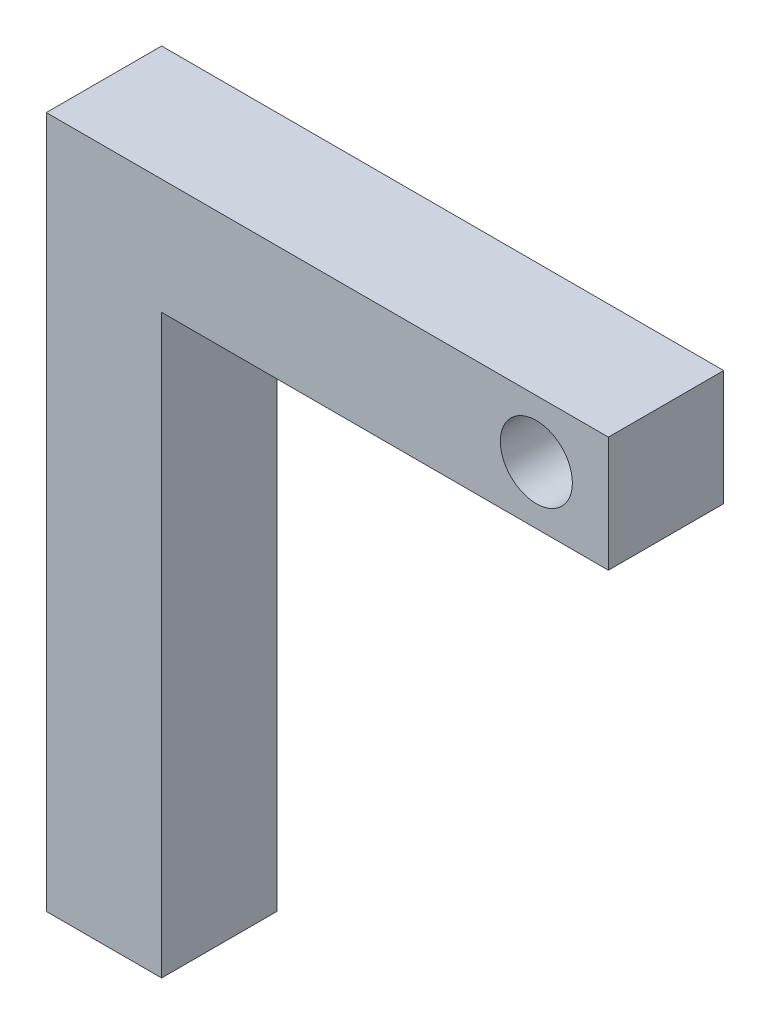
ISO-10303-21;
HEADER;
FILE_DESCRIPTION(('STEP AP214'),'2;1');
FILE_NAME('part.step','',(''),(''),'','','');
FILE_SCHEMA(('AUTOMOTIVE_DESIGN { 1 0 10303 214 1 1 1 1 }'));
ENDSEC;
DATA;
#1=APPLICATION_CONTEXT('core data for automotive mechanical design processes');
#2=APPLICATION_PROTOCOL_DEFINITION('international standard','automotive_design',2000,#1);
#3=PRODUCT_CONTEXT('',#1,'mechanical');
#4=PRODUCT('Part','Part','',(#3));
#5=PRODUCT_RELATED_PRODUCT_CATEGORY('part','',(#4));
#6=PRODUCT_DEFINITION_FORMATION('','',#4);
#7=PRODUCT_DEFINITION_CONTEXT('part definition',#1,'design');
#8=PRODUCT_DEFINITION('design','',#6,#7);
#9=PRODUCT_DEFINITION_SHAPE('','',#8);
#10=(LENGTH_UNIT() NAMED_UNIT(*) SI_UNIT(.MILLI.,.METRE.));
#11=(NAMED_UNIT(*) PLANE_ANGLE_UNIT() SI_UNIT($,.RADIAN.));
#12=(NAMED_UNIT(*) SI_UNIT($,.STERADIAN.) SOLID_ANGLE_UNIT());
#13=UNCERTAINTY_MEASURE_WITH_UNIT(LENGTH_MEASURE(1.E-05),#10,'distance_accuracy_value','');
#14=(GEOMETRIC_REPRESENTATION_CONTEXT(3) GLOBAL_UNCERTAINTY_ASSIGNED_CONTEXT((#13)) GLOBAL_UNIT_ASSIGNED_CONTEXT((#10,
#11,#12)) REPRESENTATION_CONTEXT('',''));
#15=CARTESIAN_POINT('',(0.,0.,0.));
#16=DIRECTION('',(0.,0.,1.));
#17=DIRECTION('',(1.,0.,0.));
#18=AXIS2_PLACEMENT_3D('',#15,#16,#17);
#19=CARTESIAN_POINT('',(80.,0.,80.));
#20=DIRECTION('',(0.,1.,0.));
#21=DIRECTION('',(0.,0.,1.));
#22=AXIS2_PLACEMENT_3D('',#19,#20,#21);
#23=PLANE('',#22);
#24=DIRECTION('',(1.,0.,0.));
#25=VECTOR('',#24,1.);
#26=CARTESIAN_POINT('',(80.,0.,0.));
#27=LINE('',#26,#25);
#28=CARTESIAN_POINT('',(0.,0.,0.));
#29=VERTEX_POINT('',#28);
#30=CARTESIAN_POINT('',(80.,0.,0.));
#31=VERTEX_POINT('',#30);
#32=EDGE_CURVE('E129',#29,#31,#27,.T.);
#33=ORIENTED_EDGE('',*,*,#32,.T.);
#34=DIRECTION('',(0.,0.,-1.));
#35=VECTOR('',#34,1.);
#36=CARTESIAN_POINT('',(80.,0.,80.));
#37=LINE('',#36,#35);
#38=CARTESIAN_POINT('',(80.,0.,80.));
#39=VERTEX_POINT('',#38);
#40=EDGE_CURVE('E11',#39,#31,#37,.T.);
#41=ORIENTED_EDGE('',*,*,#40,.F.);
#42=DIRECTION('',(1.,0.,0.));
#43=VECTOR('',#42,1.);
#44=CARTESIAN_POINT('',(80.,0.,80.));
#45=LINE('',#44,#43);
#46=CARTESIAN_POINT('',(0.,0.,80.));
#47=VERTEX_POINT('',#46);
#48=EDGE_CURVE('E145',#47,#39,#45,.T.);
#49=ORIENTED_EDGE('',*,*,#48,.F.);
#50=DIRECTION('',(0.,0.,-1.));
#51=VECTOR('',#50,1.);
#52=CARTESIAN_POINT('',(0.,0.,80.));
#53=LINE('',#52,#51);
#54=EDGE_CURVE('E125',#47,#29,#53,.T.);
#55=ORIENTED_EDGE('',*,*,#54,.T.);
#56=EDGE_LOOP('',(#33,#41,#49,#55));
#57=FACE_BOUND('',#56,.T.);
#58=ADVANCED_FACE('F39',(#57),#23,.F.);
#59=CARTESIAN_POINT('',(80.,400.000000000005,80.));
#60=DIRECTION('',(-1.,0.,0.));
#61=DIRECTION('',(0.,-1.,0.));
#62=AXIS2_PLACEMENT_3D('',#59,#60,#61);
#63=PLANE('',#62);
#64=DIRECTION('',(0.,1.,0.));
#65=VECTOR('',#64,1.);
#66=CARTESIAN_POINT('',(80.,400.000000000005,0.));
#67=LINE('',#66,#65);
#68=CARTESIAN_POINT('',(80.,400.000000000005,0.));
#69=VERTEX_POINT('',#68);
#70=EDGE_CURVE('E133',#31,#69,#67,.T.);
#71=ORIENTED_EDGE('',*,*,#70,.T.);
#72=DIRECTION('',(0.,0.,-1.));
#73=VECTOR('',#72,1.);
#74=CARTESIAN_POINT('',(80.,400.000000000005,80.));
#75=LINE('',#74,#73);
#76=CARTESIAN_POINT('',(80.,400.000000000005,80.));
#77=VERTEX_POINT('',#76);
#78=EDGE_CURVE('E49',#77,#69,#75,.T.);
#79=ORIENTED_EDGE('',*,*,#78,.F.);
#80=DIRECTION('',(0.,1.,0.));
#81=VECTOR('',#80,1.);
#82=CARTESIAN_POINT('',(80.,400.000000000005,80.));
#83=LINE('',#82,#81);
#84=EDGE_CURVE('E94',#39,#77,#83,.T.);
#85=ORIENTED_EDGE('',*,*,#84,.F.);
#86=ORIENTED_EDGE('',*,*,#40,.T.);
#87=EDGE_LOOP('',(#71,#79,#85,#86));
#88=FACE_BOUND('',#87,.T.);
#89=ADVANCED_FACE('F175',(#88),#63,.F.);
#90=CARTESIAN_POINT('',(390.,400.000000000005,80.));
#91=DIRECTION('',(0.,1.,0.));
#92=DIRECTION('',(0.,0.,1.));
#93=AXIS2_PLACEMENT_3D('',#90,#91,#92);
#94=PLANE('',#93);
#95=DIRECTION('',(1.,0.,0.));
#96=VECTOR('',#95,1.);
#97=CARTESIAN_POINT('',(390.,400.000000000005,0.));
#98=LINE('',#97,#96);
#99=CARTESIAN_POINT('',(390.,400.000000000005,0.));
#100=VERTEX_POINT('',#99);
#101=EDGE_CURVE('E136',#69,#100,#98,.T.);
#102=ORIENTED_EDGE('',*,*,#101,.T.);
#103=DIRECTION('',(0.,0.,-1.));
#104=VECTOR('',#103,1.);
#105=CARTESIAN_POINT('',(390.,400.000000000005,80.));
#106=LINE('',#105,#104);
#107=CARTESIAN_POINT('',(390.,400.000000000005,80.));
#108=VERTEX_POINT('',#107);
#109=EDGE_CURVE('E118',#108,#100,#106,.T.);
#110=ORIENTED_EDGE('',*,*,#109,.F.);
#111=DIRECTION('',(1.,0.,0.));
#112=VECTOR('',#111,1.);
#113=CARTESIAN_POINT('',(390.,400.000000000005,80.));
#114=LINE('',#113,#112);
#115=EDGE_CURVE('E107',#77,#108,#114,.T.);
#116=ORIENTED_EDGE('',*,*,#115,.F.);
#117=ORIENTED_EDGE('',*,*,#78,.T.);
#118=EDGE_LOOP('',(#102,#110,#116,#117));
#119=FACE_BOUND('',#118,.T.);
#120=ADVANCED_FACE('F156',(#119),#94,.F.);
#121=CARTESIAN_POINT('',(390.,480.000000000005,80.));
#122=DIRECTION('',(-1.,0.,0.));
#123=DIRECTION('',(0.,0.,1.));
#124=AXIS2_PLACEMENT_3D('',#121,#122,#123);
#125=PLANE('',#124);
#126=DIRECTION('',(0.,1.,0.));
#127=VECTOR('',#126,1.);
#128=CARTESIAN_POINT('',(390.,480.000000000005,0.));
#129=LINE('',#128,#127);
#130=CARTESIAN_POINT('',(390.,480.000000000005,0.));
#131=VERTEX_POINT('',#130);
#132=EDGE_CURVE('E116',#100,#131,#129,.T.);
#133=ORIENTED_EDGE('',*,*,#132,.T.);
#134=DIRECTION('',(0.,0.,-1.));
#135=VECTOR('',#134,1.);
#136=CARTESIAN_POINT('',(390.,480.000000000005,80.));
#137=LINE('',#136,#135);
#138=CARTESIAN_POINT('',(390.,480.000000000005,80.));
#139=VERTEX_POINT('',#138);
#140=EDGE_CURVE('E113',#139,#131,#137,.T.);
#141=ORIENTED_EDGE('',*,*,#140,.F.);
#142=DIRECTION('',(0.,1.,0.));
#143=VECTOR('',#142,1.);
#144=CARTESIAN_POINT('',(390.,480.000000000005,80.));
#145=LINE('',#144,#143);
#146=EDGE_CURVE('E101',#108,#139,#145,.T.);
#147=ORIENTED_EDGE('',*,*,#146,.F.);
#148=ORIENTED_EDGE('',*,*,#109,.T.);
#149=EDGE_LOOP('',(#133,#141,#147,#148));
#150=FACE_BOUND('',#149,.T.);
#151=ADVANCED_FACE('F114',(#150),#125,.F.);
#152=CARTESIAN_POINT('',(0.,480.000000000005,80.));
#153=DIRECTION('',(0.,-1.,0.));
#154=DIRECTION('',(1.,0.,0.));
#155=AXIS2_PLACEMENT_3D('',#152,#153,#154);
#156=PLANE('',#155);
#157=DIRECTION('',(-1.,0.,0.));
#158=VECTOR('',#157,1.);
#159=CARTESIAN_POINT('',(0.,480.000000000005,0.));
#160=LINE('',#159,#158);
#161=CARTESIAN_POINT('',(0.,480.000000000005,0.));
#162=VERTEX_POINT('',#161);
#163=EDGE_CURVE('E80',#131,#162,#160,.T.);
#164=ORIENTED_EDGE('',*,*,#163,.T.);
#165=DIRECTION('',(0.,0.,-1.));
#166=VECTOR('',#165,1.);
#167=CARTESIAN_POINT('',(0.,480.000000000005,80.));
#168=LINE('',#167,#166);
#169=CARTESIAN_POINT('',(0.,480.000000000005,80.));
#170=VERTEX_POINT('',#169);
#171=EDGE_CURVE('E119',#170,#162,#168,.T.);
#172=ORIENTED_EDGE('',*,*,#171,.F.);
#173=DIRECTION('',(-1.,0.,0.));
#174=VECTOR('',#173,1.);
#175=CARTESIAN_POINT('',(0.,480.000000000005,80.));
#176=LINE('',#175,#174);
#177=EDGE_CURVE('E105',#139,#170,#176,.T.);
#178=ORIENTED_EDGE('',*,*,#177,.F.);
#179=ORIENTED_EDGE('',*,*,#140,.T.);
#180=EDGE_LOOP('',(#164,#172,#178,#179));
#181=FACE_BOUND('',#180,.T.);
#182=ADVANCED_FACE('F121',(#181),#156,.F.);
#183=CARTESIAN_POINT('',(0.,0.,80.));
#184=DIRECTION('',(1.,0.,0.));
#185=DIRECTION('',(0.,1.,0.));
#186=AXIS2_PLACEMENT_3D('',#183,#184,#185);
#187=PLANE('',#186);
#188=DIRECTION('',(0.,-1.,0.));
#189=VECTOR('',#188,1.);
#190=CARTESIAN_POINT('',(0.,0.,0.));
#191=LINE('',#190,#189);
#192=EDGE_CURVE('E86',#162,#29,#191,.T.);
#193=ORIENTED_EDGE('',*,*,#192,.T.);
#194=ORIENTED_EDGE('',*,*,#54,.F.);
#195=DIRECTION('',(0.,-1.,0.));
#196=VECTOR('',#195,1.);
#197=CARTESIAN_POINT('',(0.,0.,80.));
#198=LINE('',#197,#196);
#199=EDGE_CURVE('E57',#170,#47,#198,.T.);
#200=ORIENTED_EDGE('',*,*,#199,.F.);
#201=ORIENTED_EDGE('',*,*,#171,.T.);
#202=EDGE_LOOP('',(#193,#194,#200,#201));
#203=FACE_BOUND('',#202,.T.);
#204=ADVANCED_FACE('F163',(#203),#187,.F.);
#205=CARTESIAN_POINT('',(0.,0.,80.));
#206=DIRECTION('',(0.,0.,-1.));
#207=DIRECTION('',(-1.,0.,0.));
#208=AXIS2_PLACEMENT_3D('',#205,#206,#207);
#209=PLANE('',#208);
#210=CARTESIAN_POINT('',(340.,440.000000000005,80.));
#211=DIRECTION('',(0.,0.,1.));
#212=DIRECTION('',(1.,0.,0.));
#213=AXIS2_PLACEMENT_3D('',#210,#211,#212);
#214=CIRCLE('',#213,25.);
#215=CARTESIAN_POINT('',(365.,440.000000000005,80.));
#216=VERTEX_POINT('',#215);
#217=EDGE_CURVE('E230',#216,#216,#214,.T.);
#218=ORIENTED_EDGE('',*,*,#217,.F.);
#219=EDGE_LOOP('',(#218));
#220=FACE_BOUND('',#219,.T.);
#221=ORIENTED_EDGE('',*,*,#48,.T.);
#222=ORIENTED_EDGE('',*,*,#84,.T.);
#223=ORIENTED_EDGE('',*,*,#115,.T.);
#224=ORIENTED_EDGE('',*,*,#146,.T.);
#225=ORIENTED_EDGE('',*,*,#177,.T.);
#226=ORIENTED_EDGE('',*,*,#199,.T.);
#227=EDGE_LOOP('',(#221,#222,#223,#224,#225,#226));
#228=FACE_BOUND('',#227,.T.);
#229=ADVANCED_FACE('F103',(#220,#228),#209,.F.);
#230=CARTESIAN_POINT('',(0.,0.,0.));
#231=DIRECTION('',(0.,0.,-1.));
#232=DIRECTION('',(-1.,0.,0.));
#233=AXIS2_PLACEMENT_3D('',#230,#231,#232);
#234=PLANE('',#233);
#235=CARTESIAN_POINT('',(340.,440.000000000005,0.));
#236=DIRECTION('',(0.,0.,-1.));
#237=DIRECTION('',(-1.,0.,0.));
#238=AXIS2_PLACEMENT_3D('',#235,#236,#237);
#239=CIRCLE('',#238,25.);
#240=CARTESIAN_POINT('',(315.,440.000000000005,0.));
#241=VERTEX_POINT('',#240);
#242=EDGE_CURVE('E42',#241,#241,#239,.T.);
#243=ORIENTED_EDGE('',*,*,#242,.F.);
#244=EDGE_LOOP('',(#243));
#245=FACE_BOUND('',#244,.T.);
#246=ORIENTED_EDGE('',*,*,#32,.F.);
#247=ORIENTED_EDGE('',*,*,#192,.F.);
#248=ORIENTED_EDGE('',*,*,#163,.F.);
#249=ORIENTED_EDGE('',*,*,#132,.F.);
#250=ORIENTED_EDGE('',*,*,#101,.F.);
#251=ORIENTED_EDGE('',*,*,#70,.F.);
#252=EDGE_LOOP('',(#246,#247,#248,#249,#250,#251));
#253=FACE_BOUND('',#252,.T.);
#254=ADVANCED_FACE('F159',(#245,#253),#234,.T.);
#255=CARTESIAN_POINT('',(340.,440.000000000005,-81.));
#256=DIRECTION('',(0.,0.,1.));
#257=DIRECTION('',(1.,0.,0.));
#258=AXIS2_PLACEMENT_3D('',#255,#256,#257);
#259=CYLINDRICAL_SURFACE('',#258,25.);
#260=ORIENTED_EDGE('',*,*,#242,.T.);
#261=EDGE_LOOP('',(#260));
#262=FACE_BOUND('',#261,.T.);
#263=ORIENTED_EDGE('',*,*,#217,.T.);
#264=EDGE_LOOP('',(#263));
#265=FACE_BOUND('',#264,.T.);
#266=ADVANCED_FACE('F212',(#262,#265),#259,.F.);
#267=CLOSED_SHELL('',(#58,#89,#120,#151,#182,#204,#229,#254,#266));
#268=MANIFOLD_SOLID_BREP('B2',#267);
#269=ADVANCED_BREP_SHAPE_REPRESENTATION('',(#18,#268),#14);
#270=SHAPE_DEFINITION_REPRESENTATION(#9,#269);
ENDSEC;
END-ISO-10303-21;
